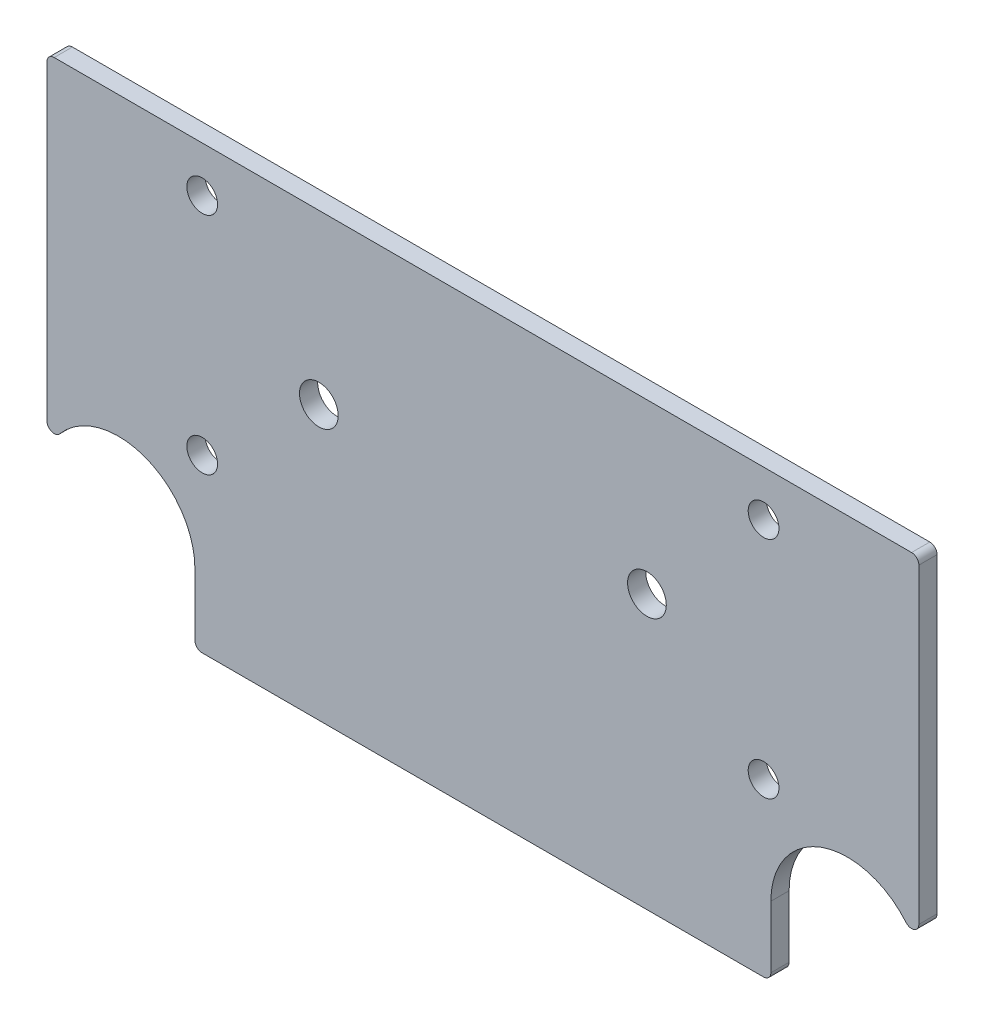
ISO-10303-21;
HEADER;
FILE_DESCRIPTION(('STEP AP214'),'2;1');
FILE_NAME('part.step','',(''),(''),'','','');
FILE_SCHEMA(('AUTOMOTIVE_DESIGN { 1 0 10303 214 1 1 1 1 }'));
ENDSEC;
DATA;
#1=APPLICATION_CONTEXT('core data for automotive mechanical design processes');
#2=APPLICATION_PROTOCOL_DEFINITION('international standard','automotive_design',2000,#1);
#3=PRODUCT_CONTEXT('',#1,'mechanical');
#4=PRODUCT('Part','Part','',(#3));
#5=PRODUCT_RELATED_PRODUCT_CATEGORY('part','',(#4));
#6=PRODUCT_DEFINITION_FORMATION('','',#4);
#7=PRODUCT_DEFINITION_CONTEXT('part definition',#1,'design');
#8=PRODUCT_DEFINITION('design','',#6,#7);
#9=PRODUCT_DEFINITION_SHAPE('','',#8);
#10=(LENGTH_UNIT() NAMED_UNIT(*) SI_UNIT(.MILLI.,.METRE.));
#11=(NAMED_UNIT(*) PLANE_ANGLE_UNIT() SI_UNIT($,.RADIAN.));
#12=(NAMED_UNIT(*) SI_UNIT($,.STERADIAN.) SOLID_ANGLE_UNIT());
#13=UNCERTAINTY_MEASURE_WITH_UNIT(LENGTH_MEASURE(1.E-05),#10,'distance_accuracy_value','');
#14=(GEOMETRIC_REPRESENTATION_CONTEXT(3) GLOBAL_UNCERTAINTY_ASSIGNED_CONTEXT((#13)) GLOBAL_UNIT_ASSIGNED_CONTEXT((#10,
#11,#12)) REPRESENTATION_CONTEXT('',''));
#15=CARTESIAN_POINT('',(0.,0.,0.));
#16=DIRECTION('',(0.,0.,1.));
#17=DIRECTION('',(1.,0.,0.));
#18=AXIS2_PLACEMENT_3D('',#15,#16,#17);
#19=CARTESIAN_POINT('',(127.,-1.26999999999994,0.));
#20=DIRECTION('',(0.,0.,-1.));
#21=DIRECTION('',(-1.,0.,0.));
#22=AXIS2_PLACEMENT_3D('',#19,#20,#21);
#23=PLANE('',#22);
#24=CARTESIAN_POINT('',(57.1500000000001,69.85,0.));
#25=DIRECTION('',(0.,0.,1.));
#26=DIRECTION('',(1.,0.,0.));
#27=AXIS2_PLACEMENT_3D('',#24,#25,#26);
#28=CIRCLE('',#27,6.74623999999999);
#29=CARTESIAN_POINT('',(63.8962400000001,69.85,0.));
#30=VERTEX_POINT('',#29);
#31=EDGE_CURVE('E365',#30,#30,#28,.T.);
#32=ORIENTED_EDGE('',*,*,#31,.T.);
#33=EDGE_LOOP('',(#32));
#34=FACE_BOUND('',#33,.T.);
#35=CARTESIAN_POINT('',(-57.1500000000001,69.85,0.));
#36=DIRECTION('',(0.,0.,1.));
#37=DIRECTION('',(1.,0.,0.));
#38=AXIS2_PLACEMENT_3D('',#35,#36,#37);
#39=CIRCLE('',#38,6.74624);
#40=CARTESIAN_POINT('',(-50.4037600000001,69.85,0.));
#41=VERTEX_POINT('',#40);
#42=EDGE_CURVE('E357',#41,#41,#39,.T.);
#43=ORIENTED_EDGE('',*,*,#42,.T.);
#44=EDGE_LOOP('',(#43));
#45=FACE_BOUND('',#44,.T.);
#46=CARTESIAN_POINT('',(-97.7899999999998,34.29,0.));
#47=DIRECTION('',(0.,0.,1.));
#48=DIRECTION('',(1.,0.,0.));
#49=AXIS2_PLACEMENT_3D('',#46,#47,#48);
#50=CIRCLE('',#49,5.357876);
#51=CARTESIAN_POINT('',(-92.4321239999998,34.29,0.));
#52=VERTEX_POINT('',#51);
#53=EDGE_CURVE('E349',#52,#52,#50,.T.);
#54=ORIENTED_EDGE('',*,*,#53,.T.);
#55=EDGE_LOOP('',(#54));
#56=FACE_BOUND('',#55,.T.);
#57=CARTESIAN_POINT('',(-97.7899999999998,112.583282570265,0.));
#58=DIRECTION('',(0.,0.,1.));
#59=DIRECTION('',(1.,0.,0.));
#60=AXIS2_PLACEMENT_3D('',#57,#58,#59);
#61=CIRCLE('',#60,5.357876);
#62=CARTESIAN_POINT('',(-92.4321239999998,112.583282570265,0.));
#63=VERTEX_POINT('',#62);
#64=EDGE_CURVE('E343',#63,#63,#61,.T.);
#65=ORIENTED_EDGE('',*,*,#64,.T.);
#66=EDGE_LOOP('',(#65));
#67=FACE_BOUND('',#66,.T.);
#68=CARTESIAN_POINT('',(97.7899999999999,34.29,0.));
#69=DIRECTION('',(0.,0.,1.));
#70=DIRECTION('',(1.,0.,0.));
#71=AXIS2_PLACEMENT_3D('',#68,#69,#70);
#72=CIRCLE('',#71,5.357876);
#73=CARTESIAN_POINT('',(103.147876,34.29,0.));
#74=VERTEX_POINT('',#73);
#75=EDGE_CURVE('E335',#74,#74,#72,.T.);
#76=ORIENTED_EDGE('',*,*,#75,.T.);
#77=EDGE_LOOP('',(#76));
#78=FACE_BOUND('',#77,.T.);
#79=DIRECTION('',(0.,1.,0.));
#80=VECTOR('',#79,1.);
#81=CARTESIAN_POINT('',(100.33,-1.26999999999994,0.));
#82=LINE('',#81,#80);
#83=CARTESIAN_POINT('',(100.33,-22.8599999999999,0.));
#84=VERTEX_POINT('',#83);
#85=CARTESIAN_POINT('',(100.33,-1.26999999999994,0.));
#86=VERTEX_POINT('',#85);
#87=EDGE_CURVE('E214',#84,#86,#82,.T.);
#88=ORIENTED_EDGE('',*,*,#87,.F.);
#89=CARTESIAN_POINT('',(97.79,-22.8599999999999,0.));
#90=DIRECTION('',(0.,0.,-1.));
#91=DIRECTION('',(-1.,0.,0.));
#92=AXIS2_PLACEMENT_3D('',#89,#90,#91);
#93=CIRCLE('',#92,2.54);
#94=CARTESIAN_POINT('',(97.79,-25.3999999999999,0.));
#95=VERTEX_POINT('',#94);
#96=EDGE_CURVE('E240',#84,#95,#93,.T.);
#97=ORIENTED_EDGE('',*,*,#96,.T.);
#98=DIRECTION('',(1.,0.,0.));
#99=VECTOR('',#98,1.);
#100=CARTESIAN_POINT('',(100.33,-25.3999999999999,0.));
#101=LINE('',#100,#99);
#102=CARTESIAN_POINT('',(-97.79,-25.4,0.));
#103=VERTEX_POINT('',#102);
#104=EDGE_CURVE('E210',#103,#95,#101,.T.);
#105=ORIENTED_EDGE('',*,*,#104,.F.);
#106=CARTESIAN_POINT('',(-97.79,-22.86,0.));
#107=DIRECTION('',(0.,0.,-1.));
#108=DIRECTION('',(-1.,0.,0.));
#109=AXIS2_PLACEMENT_3D('',#106,#107,#108);
#110=CIRCLE('',#109,2.54);
#111=CARTESIAN_POINT('',(-100.33,-22.86,0.));
#112=VERTEX_POINT('',#111);
#113=EDGE_CURVE('E237',#103,#112,#110,.T.);
#114=ORIENTED_EDGE('',*,*,#113,.T.);
#115=DIRECTION('',(0.,-1.,0.));
#116=VECTOR('',#115,1.);
#117=CARTESIAN_POINT('',(-100.33,-25.4,0.));
#118=LINE('',#117,#116);
#119=CARTESIAN_POINT('',(-100.33,-1.26999999999997,0.));
#120=VERTEX_POINT('',#119);
#121=EDGE_CURVE('E207',#120,#112,#118,.T.);
#122=ORIENTED_EDGE('',*,*,#121,.F.);
#123=CARTESIAN_POINT('',(-127.,-1.26999999999997,0.));
#124=DIRECTION('',(0.,0.,-1.));
#125=DIRECTION('',(1.,0.,0.));
#126=AXIS2_PLACEMENT_3D('',#123,#124,#125);
#127=CIRCLE('',#126,26.67);
#128=CARTESIAN_POINT('',(-147.408347826087,15.8993983298616,0.));
#129=VERTEX_POINT('',#128);
#130=EDGE_CURVE('E179',#129,#120,#127,.T.);
#131=ORIENTED_EDGE('',*,*,#130,.F.);
#132=CARTESIAN_POINT('',(-149.352,17.5345791231817,0.));
#133=DIRECTION('',(0.,0.,-1.));
#134=DIRECTION('',(-1.,0.,0.));
#135=AXIS2_PLACEMENT_3D('',#132,#133,#134);
#136=CIRCLE('',#135,2.54);
#137=CARTESIAN_POINT('',(-151.892,17.5345791231817,0.));
#138=VERTEX_POINT('',#137);
#139=EDGE_CURVE('E234',#129,#138,#136,.T.);
#140=ORIENTED_EDGE('',*,*,#139,.T.);
#141=DIRECTION('',(0.,-1.,0.));
#142=VECTOR('',#141,1.);
#143=CARTESIAN_POINT('',(-151.892,128.458282570265,0.));
#144=LINE('',#143,#142);
#145=CARTESIAN_POINT('',(-151.892,125.918282570265,0.));
#146=VERTEX_POINT('',#145);
#147=EDGE_CURVE('E310',#146,#138,#144,.T.);
#148=ORIENTED_EDGE('',*,*,#147,.F.);
#149=CARTESIAN_POINT('',(-149.352,125.918282570265,0.));
#150=DIRECTION('',(0.,0.,-1.));
#151=DIRECTION('',(-1.,0.,0.));
#152=AXIS2_PLACEMENT_3D('',#149,#150,#151);
#153=CIRCLE('',#152,2.54);
#154=CARTESIAN_POINT('',(-149.352,128.458282570265,0.));
#155=VERTEX_POINT('',#154);
#156=EDGE_CURVE('E232',#146,#155,#153,.T.);
#157=ORIENTED_EDGE('',*,*,#156,.T.);
#158=DIRECTION('',(-1.,0.,0.));
#159=VECTOR('',#158,1.);
#160=CARTESIAN_POINT('',(-179.07,128.458282570265,0.));
#161=LINE('',#160,#159);
#162=CARTESIAN_POINT('',(149.352,128.458282570265,0.));
#163=VERTEX_POINT('',#162);
#164=EDGE_CURVE('E201',#163,#155,#161,.T.);
#165=ORIENTED_EDGE('',*,*,#164,.F.);
#166=CARTESIAN_POINT('',(149.352,125.918282570265,0.));
#167=DIRECTION('',(0.,0.,-1.));
#168=DIRECTION('',(-1.,0.,0.));
#169=AXIS2_PLACEMENT_3D('',#166,#167,#168);
#170=CIRCLE('',#169,2.54);
#171=CARTESIAN_POINT('',(151.892,125.918282570265,0.));
#172=VERTEX_POINT('',#171);
#173=EDGE_CURVE('E230',#163,#172,#170,.T.);
#174=ORIENTED_EDGE('',*,*,#173,.T.);
#175=DIRECTION('',(0.,1.,0.));
#176=VECTOR('',#175,1.);
#177=CARTESIAN_POINT('',(151.892,128.458282570265,0.));
#178=LINE('',#177,#176);
#179=CARTESIAN_POINT('',(151.892,17.5345791231818,0.));
#180=VERTEX_POINT('',#179);
#181=EDGE_CURVE('E291',#180,#172,#178,.T.);
#182=ORIENTED_EDGE('',*,*,#181,.F.);
#183=CARTESIAN_POINT('',(149.352,17.5345791231818,0.));
#184=DIRECTION('',(0.,0.,-1.));
#185=DIRECTION('',(-1.,0.,0.));
#186=AXIS2_PLACEMENT_3D('',#183,#184,#185);
#187=CIRCLE('',#186,2.54);
#188=CARTESIAN_POINT('',(147.408347826087,15.8993983298616,0.));
#189=VERTEX_POINT('',#188);
#190=EDGE_CURVE('E227',#180,#189,#187,.T.);
#191=ORIENTED_EDGE('',*,*,#190,.T.);
#192=CARTESIAN_POINT('',(127.,-1.26999999999994,0.));
#193=DIRECTION('',(0.,0.,-1.));
#194=DIRECTION('',(-1.,0.,0.));
#195=AXIS2_PLACEMENT_3D('',#192,#193,#194);
#196=CIRCLE('',#195,26.67);
#197=EDGE_CURVE('E217',#86,#189,#196,.T.);
#198=ORIENTED_EDGE('',*,*,#197,.F.);
#199=EDGE_LOOP('',(#88,#97,#105,#114,#122,#131,#140,#148,#157,#165,#174,#182,#191,#198));
#200=FACE_BOUND('',#199,.T.);
#201=CARTESIAN_POINT('',(97.7899999999998,112.583282570265,0.));
#202=DIRECTION('',(0.,0.,1.));
#203=DIRECTION('',(1.,0.,0.));
#204=AXIS2_PLACEMENT_3D('',#201,#202,#203);
#205=CIRCLE('',#204,5.357876);
#206=CARTESIAN_POINT('',(103.147876,112.583282570265,0.));
#207=VERTEX_POINT('',#206);
#208=EDGE_CURVE('E325',#207,#207,#205,.T.);
#209=ORIENTED_EDGE('',*,*,#208,.T.);
#210=EDGE_LOOP('',(#209));
#211=FACE_BOUND('',#210,.T.);
#212=ADVANCED_FACE('F42',(#34,#45,#56,#67,#78,#200,#211),#23,.T.);
#213=CARTESIAN_POINT('',(-179.07,128.458282570265,6.35));
#214=DIRECTION('',(0.,-1.,0.));
#215=DIRECTION('',(1.,0.,0.));
#216=AXIS2_PLACEMENT_3D('',#213,#214,#215);
#217=PLANE('',#216);
#218=ORIENTED_EDGE('',*,*,#164,.T.);
#219=DIRECTION('',(0.,0.,-1.));
#220=VECTOR('',#219,1.);
#221=CARTESIAN_POINT('',(-149.352,128.458282570265,6.35));
#222=LINE('',#221,#220);
#223=CARTESIAN_POINT('',(-149.352,128.458282570265,6.35));
#224=VERTEX_POINT('',#223);
#225=EDGE_CURVE('E278',#155,#224,#222,.F.);
#226=ORIENTED_EDGE('',*,*,#225,.T.);
#227=DIRECTION('',(-1.,0.,0.));
#228=VECTOR('',#227,1.);
#229=CARTESIAN_POINT('',(-179.07,128.458282570265,6.35));
#230=LINE('',#229,#228);
#231=CARTESIAN_POINT('',(149.352,128.458282570265,6.35));
#232=VERTEX_POINT('',#231);
#233=EDGE_CURVE('E173',#232,#224,#230,.T.);
#234=ORIENTED_EDGE('',*,*,#233,.F.);
#235=DIRECTION('',(0.,0.,-1.));
#236=VECTOR('',#235,1.);
#237=CARTESIAN_POINT('',(149.352,128.458282570265,6.35));
#238=LINE('',#237,#236);
#239=EDGE_CURVE('E275',#232,#163,#238,.T.);
#240=ORIENTED_EDGE('',*,*,#239,.T.);
#241=EDGE_LOOP('',(#218,#226,#234,#240));
#242=FACE_BOUND('',#241,.T.);
#243=ADVANCED_FACE('F303',(#242),#217,.F.);
#244=CARTESIAN_POINT('',(-127.,-1.26999999999997,6.35));
#245=DIRECTION('',(0.,0.,-1.));
#246=DIRECTION('',(-1.,0.,0.));
#247=AXIS2_PLACEMENT_3D('',#244,#245,#246);
#248=CYLINDRICAL_SURFACE('',#247,26.67);
#249=CARTESIAN_POINT('',(-127.,-1.26999999999997,6.35));
#250=DIRECTION('',(0.,0.,-1.));
#251=DIRECTION('',(1.,0.,0.));
#252=AXIS2_PLACEMENT_3D('',#249,#250,#251);
#253=CIRCLE('',#252,26.67);
#254=CARTESIAN_POINT('',(-147.408347826087,15.8993983298616,6.35));
#255=VERTEX_POINT('',#254);
#256=CARTESIAN_POINT('',(-100.33,-1.26999999999997,6.35));
#257=VERTEX_POINT('',#256);
#258=EDGE_CURVE('E163',#255,#257,#253,.T.);
#259=ORIENTED_EDGE('',*,*,#258,.F.);
#260=DIRECTION('',(0.,0.,-1.));
#261=VECTOR('',#260,1.);
#262=CARTESIAN_POINT('',(-147.408347826087,15.8993983298616,6.35));
#263=LINE('',#262,#261);
#264=EDGE_CURVE('E266',#255,#129,#263,.T.);
#265=ORIENTED_EDGE('',*,*,#264,.T.);
#266=ORIENTED_EDGE('',*,*,#130,.T.);
#267=DIRECTION('',(0.,0.,-1.));
#268=VECTOR('',#267,1.);
#269=CARTESIAN_POINT('',(-100.33,-1.26999999999997,6.35));
#270=LINE('',#269,#268);
#271=EDGE_CURVE('E176',#257,#120,#270,.T.);
#272=ORIENTED_EDGE('',*,*,#271,.F.);
#273=EDGE_LOOP('',(#259,#265,#266,#272));
#274=FACE_BOUND('',#273,.T.);
#275=ADVANCED_FACE('F177',(#274),#248,.F.);
#276=CARTESIAN_POINT('',(-100.33,-25.4,6.35));
#277=DIRECTION('',(1.,0.,0.));
#278=DIRECTION('',(0.,1.,0.));
#279=AXIS2_PLACEMENT_3D('',#276,#277,#278);
#280=PLANE('',#279);
#281=ORIENTED_EDGE('',*,*,#121,.T.);
#282=DIRECTION('',(0.,0.,-1.));
#283=VECTOR('',#282,1.);
#284=CARTESIAN_POINT('',(-100.33,-22.86,6.35));
#285=LINE('',#284,#283);
#286=CARTESIAN_POINT('',(-100.33,-22.86,6.35));
#287=VERTEX_POINT('',#286);
#288=EDGE_CURVE('E61',#112,#287,#285,.F.);
#289=ORIENTED_EDGE('',*,*,#288,.T.);
#290=DIRECTION('',(0.,-1.,0.));
#291=VECTOR('',#290,1.);
#292=CARTESIAN_POINT('',(-100.33,-25.4,6.35));
#293=LINE('',#292,#291);
#294=EDGE_CURVE('E167',#257,#287,#293,.T.);
#295=ORIENTED_EDGE('',*,*,#294,.F.);
#296=ORIENTED_EDGE('',*,*,#271,.T.);
#297=EDGE_LOOP('',(#281,#289,#295,#296));
#298=FACE_BOUND('',#297,.T.);
#299=ADVANCED_FACE('F185',(#298),#280,.F.);
#300=CARTESIAN_POINT('',(100.33,-25.3999999999999,6.35));
#301=DIRECTION('',(0.,1.,0.));
#302=DIRECTION('',(-1.,0.,0.));
#303=AXIS2_PLACEMENT_3D('',#300,#301,#302);
#304=PLANE('',#303);
#305=ORIENTED_EDGE('',*,*,#104,.T.);
#306=DIRECTION('',(0.,0.,-1.));
#307=VECTOR('',#306,1.);
#308=CARTESIAN_POINT('',(97.79,-25.3999999999999,6.35));
#309=LINE('',#308,#307);
#310=CARTESIAN_POINT('',(97.79,-25.3999999999999,6.35));
#311=VERTEX_POINT('',#310);
#312=EDGE_CURVE('E246',#95,#311,#309,.F.);
#313=ORIENTED_EDGE('',*,*,#312,.T.);
#314=DIRECTION('',(1.,0.,0.));
#315=VECTOR('',#314,1.);
#316=CARTESIAN_POINT('',(100.33,-25.3999999999999,6.35));
#317=LINE('',#316,#315);
#318=CARTESIAN_POINT('',(-97.79,-25.4,6.35));
#319=VERTEX_POINT('',#318);
#320=EDGE_CURVE('E187',#319,#311,#317,.T.);
#321=ORIENTED_EDGE('',*,*,#320,.F.);
#322=DIRECTION('',(0.,0.,-1.));
#323=VECTOR('',#322,1.);
#324=CARTESIAN_POINT('',(-97.79,-25.4,6.35));
#325=LINE('',#324,#323);
#326=EDGE_CURVE('E243',#319,#103,#325,.T.);
#327=ORIENTED_EDGE('',*,*,#326,.T.);
#328=EDGE_LOOP('',(#305,#313,#321,#327));
#329=FACE_BOUND('',#328,.T.);
#330=ADVANCED_FACE('F420',(#329),#304,.F.);
#331=CARTESIAN_POINT('',(100.33,-1.26999999999994,6.35));
#332=DIRECTION('',(-1.,0.,0.));
#333=DIRECTION('',(0.,-1.,0.));
#334=AXIS2_PLACEMENT_3D('',#331,#332,#333);
#335=PLANE('',#334);
#336=DIRECTION('',(0.,1.,0.));
#337=VECTOR('',#336,1.);
#338=CARTESIAN_POINT('',(100.33,-1.26999999999994,6.35));
#339=LINE('',#338,#337);
#340=CARTESIAN_POINT('',(100.33,-22.8599999999999,6.35));
#341=VERTEX_POINT('',#340);
#342=CARTESIAN_POINT('',(100.33,-1.26999999999994,6.35));
#343=VERTEX_POINT('',#342);
#344=EDGE_CURVE('E191',#341,#343,#339,.T.);
#345=ORIENTED_EDGE('',*,*,#344,.F.);
#346=DIRECTION('',(0.,0.,-1.));
#347=VECTOR('',#346,1.);
#348=CARTESIAN_POINT('',(100.33,-22.8599999999999,6.35));
#349=LINE('',#348,#347);
#350=EDGE_CURVE('E182',#341,#84,#349,.T.);
#351=ORIENTED_EDGE('',*,*,#350,.T.);
#352=ORIENTED_EDGE('',*,*,#87,.T.);
#353=DIRECTION('',(0.,0.,-1.));
#354=VECTOR('',#353,1.);
#355=CARTESIAN_POINT('',(100.33,-1.26999999999994,6.35));
#356=LINE('',#355,#354);
#357=EDGE_CURVE('E183',#343,#86,#356,.T.);
#358=ORIENTED_EDGE('',*,*,#357,.F.);
#359=EDGE_LOOP('',(#345,#351,#352,#358));
#360=FACE_BOUND('',#359,.T.);
#361=ADVANCED_FACE('F416',(#360),#335,.F.);
#362=CARTESIAN_POINT('',(127.,-1.26999999999994,6.35));
#363=DIRECTION('',(0.,0.,-1.));
#364=DIRECTION('',(-1.,0.,0.));
#365=AXIS2_PLACEMENT_3D('',#362,#363,#364);
#366=CYLINDRICAL_SURFACE('',#365,26.67);
#367=ORIENTED_EDGE('',*,*,#197,.T.);
#368=DIRECTION('',(0.,0.,-1.));
#369=VECTOR('',#368,1.);
#370=CARTESIAN_POINT('',(147.408347826087,15.8993983298616,6.35));
#371=LINE('',#370,#369);
#372=CARTESIAN_POINT('',(147.408347826087,15.8993983298616,6.35));
#373=VERTEX_POINT('',#372);
#374=EDGE_CURVE('E11',#189,#373,#371,.F.);
#375=ORIENTED_EDGE('',*,*,#374,.T.);
#376=CARTESIAN_POINT('',(127.,-1.26999999999994,6.35));
#377=DIRECTION('',(0.,0.,-1.));
#378=DIRECTION('',(-1.,0.,0.));
#379=AXIS2_PLACEMENT_3D('',#376,#377,#378);
#380=CIRCLE('',#379,26.67);
#381=EDGE_CURVE('E197',#343,#373,#380,.T.);
#382=ORIENTED_EDGE('',*,*,#381,.F.);
#383=ORIENTED_EDGE('',*,*,#357,.T.);
#384=EDGE_LOOP('',(#367,#375,#382,#383));
#385=FACE_BOUND('',#384,.T.);
#386=ADVANCED_FACE('F378',(#385),#366,.F.);
#387=CARTESIAN_POINT('',(127.,-1.26999999999994,6.35));
#388=DIRECTION('',(0.,0.,-1.));
#389=DIRECTION('',(-1.,0.,0.));
#390=AXIS2_PLACEMENT_3D('',#387,#388,#389);
#391=PLANE('',#390);
#392=CARTESIAN_POINT('',(57.1500000000001,69.85,6.35));
#393=DIRECTION('',(0.,0.,1.));
#394=DIRECTION('',(1.,0.,0.));
#395=AXIS2_PLACEMENT_3D('',#392,#393,#394);
#396=CIRCLE('',#395,6.74623999999999);
#397=CARTESIAN_POINT('',(63.8962400000001,69.85,6.35));
#398=VERTEX_POINT('',#397);
#399=EDGE_CURVE('E369',#398,#398,#396,.T.);
#400=ORIENTED_EDGE('',*,*,#399,.F.);
#401=EDGE_LOOP('',(#400));
#402=FACE_BOUND('',#401,.T.);
#403=CARTESIAN_POINT('',(-57.1500000000001,69.85,6.35));
#404=DIRECTION('',(0.,0.,1.));
#405=DIRECTION('',(1.,0.,0.));
#406=AXIS2_PLACEMENT_3D('',#403,#404,#405);
#407=CIRCLE('',#406,6.74624);
#408=CARTESIAN_POINT('',(-50.4037600000001,69.85,6.35));
#409=VERTEX_POINT('',#408);
#410=EDGE_CURVE('E361',#409,#409,#407,.T.);
#411=ORIENTED_EDGE('',*,*,#410,.F.);
#412=EDGE_LOOP('',(#411));
#413=FACE_BOUND('',#412,.T.);
#414=CARTESIAN_POINT('',(-97.7899999999998,34.29,6.35));
#415=DIRECTION('',(0.,0.,1.));
#416=DIRECTION('',(1.,0.,0.));
#417=AXIS2_PLACEMENT_3D('',#414,#415,#416);
#418=CIRCLE('',#417,5.35787599999998);
#419=CARTESIAN_POINT('',(-92.4321239999999,34.29,6.35));
#420=VERTEX_POINT('',#419);
#421=EDGE_CURVE('E353',#420,#420,#418,.T.);
#422=ORIENTED_EDGE('',*,*,#421,.F.);
#423=EDGE_LOOP('',(#422));
#424=FACE_BOUND('',#423,.T.);
#425=CARTESIAN_POINT('',(-97.7899999999998,112.583282570265,6.35));
#426=DIRECTION('',(0.,0.,1.));
#427=DIRECTION('',(1.,0.,0.));
#428=AXIS2_PLACEMENT_3D('',#425,#426,#427);
#429=CIRCLE('',#428,5.35787599999998);
#430=CARTESIAN_POINT('',(-92.4321239999999,112.583282570265,6.35));
#431=VERTEX_POINT('',#430);
#432=EDGE_CURVE('E346',#431,#431,#429,.T.);
#433=ORIENTED_EDGE('',*,*,#432,.F.);
#434=EDGE_LOOP('',(#433));
#435=FACE_BOUND('',#434,.T.);
#436=CARTESIAN_POINT('',(97.7899999999999,34.29,6.35));
#437=DIRECTION('',(0.,0.,1.));
#438=DIRECTION('',(1.,0.,0.));
#439=AXIS2_PLACEMENT_3D('',#436,#437,#438);
#440=CIRCLE('',#439,5.35787599999998);
#441=CARTESIAN_POINT('',(103.147876,34.29,6.35));
#442=VERTEX_POINT('',#441);
#443=EDGE_CURVE('E339',#442,#442,#440,.T.);
#444=ORIENTED_EDGE('',*,*,#443,.F.);
#445=EDGE_LOOP('',(#444));
#446=FACE_BOUND('',#445,.T.);
#447=CARTESIAN_POINT('',(97.7899999999998,112.583282570265,6.35));
#448=DIRECTION('',(0.,0.,1.));
#449=DIRECTION('',(1.,0.,0.));
#450=AXIS2_PLACEMENT_3D('',#447,#448,#449);
#451=CIRCLE('',#450,5.35787599999998);
#452=CARTESIAN_POINT('',(103.147876,112.583282570265,6.35));
#453=VERTEX_POINT('',#452);
#454=EDGE_CURVE('E331',#453,#453,#451,.T.);
#455=ORIENTED_EDGE('',*,*,#454,.F.);
#456=EDGE_LOOP('',(#455));
#457=FACE_BOUND('',#456,.T.);
#458=ORIENTED_EDGE('',*,*,#320,.T.);
#459=CARTESIAN_POINT('',(97.79,-22.8599999999999,6.35));
#460=DIRECTION('',(0.,0.,-1.));
#461=DIRECTION('',(-1.,0.,0.));
#462=AXIS2_PLACEMENT_3D('',#459,#460,#461);
#463=CIRCLE('',#462,2.54);
#464=EDGE_CURVE('E261',#311,#341,#463,.F.);
#465=ORIENTED_EDGE('',*,*,#464,.T.);
#466=ORIENTED_EDGE('',*,*,#344,.T.);
#467=ORIENTED_EDGE('',*,*,#381,.T.);
#468=CARTESIAN_POINT('',(149.352,17.5345791231818,6.35));
#469=DIRECTION('',(0.,0.,-1.));
#470=DIRECTION('',(-1.,0.,0.));
#471=AXIS2_PLACEMENT_3D('',#468,#469,#470);
#472=CIRCLE('',#471,2.54);
#473=CARTESIAN_POINT('',(151.892,17.5345791231818,6.35));
#474=VERTEX_POINT('',#473);
#475=EDGE_CURVE('E249',#373,#474,#472,.F.);
#476=ORIENTED_EDGE('',*,*,#475,.T.);
#477=DIRECTION('',(0.,1.,0.));
#478=VECTOR('',#477,1.);
#479=CARTESIAN_POINT('',(151.892,128.458282570265,6.35));
#480=LINE('',#479,#478);
#481=CARTESIAN_POINT('',(151.892,125.918282570265,6.35));
#482=VERTEX_POINT('',#481);
#483=EDGE_CURVE('E204',#474,#482,#480,.T.);
#484=ORIENTED_EDGE('',*,*,#483,.T.);
#485=CARTESIAN_POINT('',(149.352,125.918282570265,6.35));
#486=DIRECTION('',(0.,0.,-1.));
#487=DIRECTION('',(-1.,0.,0.));
#488=AXIS2_PLACEMENT_3D('',#485,#486,#487);
#489=CIRCLE('',#488,2.54);
#490=EDGE_CURVE('E252',#482,#232,#489,.F.);
#491=ORIENTED_EDGE('',*,*,#490,.T.);
#492=ORIENTED_EDGE('',*,*,#233,.T.);
#493=CARTESIAN_POINT('',(-149.352,125.918282570265,6.35));
#494=DIRECTION('',(0.,0.,-1.));
#495=DIRECTION('',(-1.,0.,0.));
#496=AXIS2_PLACEMENT_3D('',#493,#494,#495);
#497=CIRCLE('',#496,2.54);
#498=CARTESIAN_POINT('',(-151.892,125.918282570265,6.35));
#499=VERTEX_POINT('',#498);
#500=EDGE_CURVE('E254',#224,#499,#497,.F.);
#501=ORIENTED_EDGE('',*,*,#500,.T.);
#502=DIRECTION('',(0.,-1.,0.));
#503=VECTOR('',#502,1.);
#504=CARTESIAN_POINT('',(-151.892,128.458282570265,6.35));
#505=LINE('',#504,#503);
#506=CARTESIAN_POINT('',(-151.892,17.5345791231817,6.35));
#507=VERTEX_POINT('',#506);
#508=EDGE_CURVE('E319',#499,#507,#505,.T.);
#509=ORIENTED_EDGE('',*,*,#508,.T.);
#510=CARTESIAN_POINT('',(-149.352,17.5345791231817,6.35));
#511=DIRECTION('',(0.,0.,-1.));
#512=DIRECTION('',(-1.,0.,0.));
#513=AXIS2_PLACEMENT_3D('',#510,#511,#512);
#514=CIRCLE('',#513,2.54);
#515=EDGE_CURVE('E72',#507,#255,#514,.F.);
#516=ORIENTED_EDGE('',*,*,#515,.T.);
#517=ORIENTED_EDGE('',*,*,#258,.T.);
#518=ORIENTED_EDGE('',*,*,#294,.T.);
#519=CARTESIAN_POINT('',(-97.79,-22.86,6.35));
#520=DIRECTION('',(0.,0.,-1.));
#521=DIRECTION('',(-1.,0.,0.));
#522=AXIS2_PLACEMENT_3D('',#519,#520,#521);
#523=CIRCLE('',#522,2.54);
#524=EDGE_CURVE('E258',#287,#319,#523,.F.);
#525=ORIENTED_EDGE('',*,*,#524,.T.);
#526=EDGE_LOOP('',(#458,#465,#466,#467,#476,#484,#491,#492,#501,#509,#516,#517,#518,#525));
#527=FACE_BOUND('',#526,.T.);
#528=ADVANCED_FACE('F166',(#402,#413,#424,#435,#446,#457,#527),#391,.F.);
#529=CARTESIAN_POINT('',(-151.892,128.458282570265,6.35));
#530=DIRECTION('',(1.,0.,0.));
#531=DIRECTION('',(0.,1.,0.));
#532=AXIS2_PLACEMENT_3D('',#529,#530,#531);
#533=PLANE('',#532);
#534=ORIENTED_EDGE('',*,*,#147,.T.);
#535=DIRECTION('',(0.,0.,-1.));
#536=VECTOR('',#535,1.);
#537=CARTESIAN_POINT('',(-151.892,17.5345791231817,6.35));
#538=LINE('',#537,#536);
#539=EDGE_CURVE('E272',#138,#507,#538,.F.);
#540=ORIENTED_EDGE('',*,*,#539,.T.);
#541=ORIENTED_EDGE('',*,*,#508,.F.);
#542=DIRECTION('',(0.,0.,-1.));
#543=VECTOR('',#542,1.);
#544=CARTESIAN_POINT('',(-151.892,125.918282570265,6.35));
#545=LINE('',#544,#543);
#546=EDGE_CURVE('E269',#499,#146,#545,.T.);
#547=ORIENTED_EDGE('',*,*,#546,.T.);
#548=EDGE_LOOP('',(#534,#540,#541,#547));
#549=FACE_BOUND('',#548,.T.);
#550=ADVANCED_FACE('F317',(#549),#533,.F.);
#551=CARTESIAN_POINT('',(151.892,128.458282570265,6.35));
#552=DIRECTION('',(-1.,0.,0.));
#553=DIRECTION('',(0.,-1.,0.));
#554=AXIS2_PLACEMENT_3D('',#551,#552,#553);
#555=PLANE('',#554);
#556=ORIENTED_EDGE('',*,*,#181,.T.);
#557=DIRECTION('',(0.,0.,-1.));
#558=VECTOR('',#557,1.);
#559=CARTESIAN_POINT('',(151.892,125.918282570265,6.35));
#560=LINE('',#559,#558);
#561=EDGE_CURVE('E51',#172,#482,#560,.F.);
#562=ORIENTED_EDGE('',*,*,#561,.T.);
#563=ORIENTED_EDGE('',*,*,#483,.F.);
#564=DIRECTION('',(0.,0.,-1.));
#565=VECTOR('',#564,1.);
#566=CARTESIAN_POINT('',(151.892,17.5345791231818,6.35));
#567=LINE('',#566,#565);
#568=EDGE_CURVE('E280',#474,#180,#567,.T.);
#569=ORIENTED_EDGE('',*,*,#568,.T.);
#570=EDGE_LOOP('',(#556,#562,#563,#569));
#571=FACE_BOUND('',#570,.T.);
#572=ADVANCED_FACE('F288',(#571),#555,.F.);
#573=CARTESIAN_POINT('',(97.7899999999998,112.583282570265,6.35));
#574=DIRECTION('',(0.,0.,1.));
#575=DIRECTION('',(1.,0.,0.));
#576=AXIS2_PLACEMENT_3D('',#573,#574,#575);
#577=CYLINDRICAL_SURFACE('',#576,5.35787599999999);
#578=ORIENTED_EDGE('',*,*,#208,.F.);
#579=EDGE_LOOP('',(#578));
#580=FACE_BOUND('',#579,.T.);
#581=ORIENTED_EDGE('',*,*,#454,.T.);
#582=EDGE_LOOP('',(#581));
#583=FACE_BOUND('',#582,.T.);
#584=ADVANCED_FACE('F390',(#580,#583),#577,.F.);
#585=CARTESIAN_POINT('',(97.7899999999999,34.29,6.35));
#586=DIRECTION('',(0.,0.,1.));
#587=DIRECTION('',(1.,0.,0.));
#588=AXIS2_PLACEMENT_3D('',#585,#586,#587);
#589=CYLINDRICAL_SURFACE('',#588,5.35787599999999);
#590=ORIENTED_EDGE('',*,*,#75,.F.);
#591=EDGE_LOOP('',(#590));
#592=FACE_BOUND('',#591,.T.);
#593=ORIENTED_EDGE('',*,*,#443,.T.);
#594=EDGE_LOOP('',(#593));
#595=FACE_BOUND('',#594,.T.);
#596=ADVANCED_FACE('F392',(#592,#595),#589,.F.);
#597=CARTESIAN_POINT('',(-97.7899999999998,112.583282570265,6.35));
#598=DIRECTION('',(0.,0.,1.));
#599=DIRECTION('',(1.,0.,0.));
#600=AXIS2_PLACEMENT_3D('',#597,#598,#599);
#601=CYLINDRICAL_SURFACE('',#600,5.35787599999999);
#602=ORIENTED_EDGE('',*,*,#64,.F.);
#603=EDGE_LOOP('',(#602));
#604=FACE_BOUND('',#603,.T.);
#605=ORIENTED_EDGE('',*,*,#432,.T.);
#606=EDGE_LOOP('',(#605));
#607=FACE_BOUND('',#606,.T.);
#608=ADVANCED_FACE('F399',(#604,#607),#601,.F.);
#609=CARTESIAN_POINT('',(-97.7899999999998,34.29,6.35));
#610=DIRECTION('',(0.,0.,1.));
#611=DIRECTION('',(1.,0.,0.));
#612=AXIS2_PLACEMENT_3D('',#609,#610,#611);
#613=CYLINDRICAL_SURFACE('',#612,5.35787599999999);
#614=ORIENTED_EDGE('',*,*,#53,.F.);
#615=EDGE_LOOP('',(#614));
#616=FACE_BOUND('',#615,.T.);
#617=ORIENTED_EDGE('',*,*,#421,.T.);
#618=EDGE_LOOP('',(#617));
#619=FACE_BOUND('',#618,.T.);
#620=ADVANCED_FACE('F433',(#616,#619),#613,.F.);
#621=CARTESIAN_POINT('',(97.79,-22.8599999999999,6.35));
#622=DIRECTION('',(0.,0.,-1.));
#623=DIRECTION('',(-1.,0.,0.));
#624=AXIS2_PLACEMENT_3D('',#621,#622,#623);
#625=CYLINDRICAL_SURFACE('',#624,2.54);
#626=ORIENTED_EDGE('',*,*,#464,.F.);
#627=ORIENTED_EDGE('',*,*,#312,.F.);
#628=ORIENTED_EDGE('',*,*,#96,.F.);
#629=ORIENTED_EDGE('',*,*,#350,.F.);
#630=EDGE_LOOP('',(#626,#627,#628,#629));
#631=FACE_BOUND('',#630,.T.);
#632=ADVANCED_FACE('F429',(#631),#625,.T.);
#633=CARTESIAN_POINT('',(-97.79,-22.86,6.35));
#634=DIRECTION('',(0.,0.,-1.));
#635=DIRECTION('',(-1.,0.,0.));
#636=AXIS2_PLACEMENT_3D('',#633,#634,#635);
#637=CYLINDRICAL_SURFACE('',#636,2.54);
#638=ORIENTED_EDGE('',*,*,#524,.F.);
#639=ORIENTED_EDGE('',*,*,#288,.F.);
#640=ORIENTED_EDGE('',*,*,#113,.F.);
#641=ORIENTED_EDGE('',*,*,#326,.F.);
#642=EDGE_LOOP('',(#638,#639,#640,#641));
#643=FACE_BOUND('',#642,.T.);
#644=ADVANCED_FACE('F432',(#643),#637,.T.);
#645=CARTESIAN_POINT('',(-149.352,17.5345791231817,6.35));
#646=DIRECTION('',(0.,0.,-1.));
#647=DIRECTION('',(-1.,0.,0.));
#648=AXIS2_PLACEMENT_3D('',#645,#646,#647);
#649=CYLINDRICAL_SURFACE('',#648,2.54);
#650=ORIENTED_EDGE('',*,*,#515,.F.);
#651=ORIENTED_EDGE('',*,*,#539,.F.);
#652=ORIENTED_EDGE('',*,*,#139,.F.);
#653=ORIENTED_EDGE('',*,*,#264,.F.);
#654=EDGE_LOOP('',(#650,#651,#652,#653));
#655=FACE_BOUND('',#654,.T.);
#656=ADVANCED_FACE('F437',(#655),#649,.T.);
#657=CARTESIAN_POINT('',(-149.352,125.918282570265,6.35));
#658=DIRECTION('',(0.,0.,-1.));
#659=DIRECTION('',(-1.,0.,0.));
#660=AXIS2_PLACEMENT_3D('',#657,#658,#659);
#661=CYLINDRICAL_SURFACE('',#660,2.54);
#662=ORIENTED_EDGE('',*,*,#500,.F.);
#663=ORIENTED_EDGE('',*,*,#225,.F.);
#664=ORIENTED_EDGE('',*,*,#156,.F.);
#665=ORIENTED_EDGE('',*,*,#546,.F.);
#666=EDGE_LOOP('',(#662,#663,#664,#665));
#667=FACE_BOUND('',#666,.T.);
#668=ADVANCED_FACE('F314',(#667),#661,.T.);
#669=CARTESIAN_POINT('',(149.352,125.918282570265,6.35));
#670=DIRECTION('',(0.,0.,-1.));
#671=DIRECTION('',(-1.,0.,0.));
#672=AXIS2_PLACEMENT_3D('',#669,#670,#671);
#673=CYLINDRICAL_SURFACE('',#672,2.54);
#674=ORIENTED_EDGE('',*,*,#490,.F.);
#675=ORIENTED_EDGE('',*,*,#561,.F.);
#676=ORIENTED_EDGE('',*,*,#173,.F.);
#677=ORIENTED_EDGE('',*,*,#239,.F.);
#678=EDGE_LOOP('',(#674,#675,#676,#677));
#679=FACE_BOUND('',#678,.T.);
#680=ADVANCED_FACE('F300',(#679),#673,.T.);
#681=CARTESIAN_POINT('',(149.352,17.5345791231818,6.35));
#682=DIRECTION('',(0.,0.,-1.));
#683=DIRECTION('',(-1.,0.,0.));
#684=AXIS2_PLACEMENT_3D('',#681,#682,#683);
#685=CYLINDRICAL_SURFACE('',#684,2.54);
#686=ORIENTED_EDGE('',*,*,#475,.F.);
#687=ORIENTED_EDGE('',*,*,#374,.F.);
#688=ORIENTED_EDGE('',*,*,#190,.F.);
#689=ORIENTED_EDGE('',*,*,#568,.F.);
#690=EDGE_LOOP('',(#686,#687,#688,#689));
#691=FACE_BOUND('',#690,.T.);
#692=ADVANCED_FACE('F44',(#691),#685,.T.);
#693=CARTESIAN_POINT('',(-57.1500000000001,69.85,6.35));
#694=DIRECTION('',(0.,0.,1.));
#695=DIRECTION('',(1.,0.,0.));
#696=AXIS2_PLACEMENT_3D('',#693,#694,#695);
#697=CYLINDRICAL_SURFACE('',#696,6.74624);
#698=ORIENTED_EDGE('',*,*,#42,.F.);
#699=EDGE_LOOP('',(#698));
#700=FACE_BOUND('',#699,.T.);
#701=ORIENTED_EDGE('',*,*,#410,.T.);
#702=EDGE_LOOP('',(#701));
#703=FACE_BOUND('',#702,.T.);
#704=ADVANCED_FACE('F447',(#700,#703),#697,.F.);
#705=CARTESIAN_POINT('',(57.1500000000001,69.85,6.35));
#706=DIRECTION('',(0.,0.,1.));
#707=DIRECTION('',(1.,0.,0.));
#708=AXIS2_PLACEMENT_3D('',#705,#706,#707);
#709=CYLINDRICAL_SURFACE('',#708,6.74623999999999);
#710=ORIENTED_EDGE('',*,*,#31,.F.);
#711=EDGE_LOOP('',(#710));
#712=FACE_BOUND('',#711,.T.);
#713=ORIENTED_EDGE('',*,*,#399,.T.);
#714=EDGE_LOOP('',(#713));
#715=FACE_BOUND('',#714,.T.);
#716=ADVANCED_FACE('F374',(#712,#715),#709,.F.);
#717=CLOSED_SHELL('',(#212,#243,#275,#299,#330,#361,#386,#528,#550,#572,#584,#596,#608,#620,
#632,#644,#656,#668,#680,#692,#704,#716));
#718=MANIFOLD_SOLID_BREP('B2',#717);
#719=ADVANCED_BREP_SHAPE_REPRESENTATION('',(#18,#718),#14);
#720=SHAPE_DEFINITION_REPRESENTATION(#9,#719);
ENDSEC;
END-ISO-10303-21;
